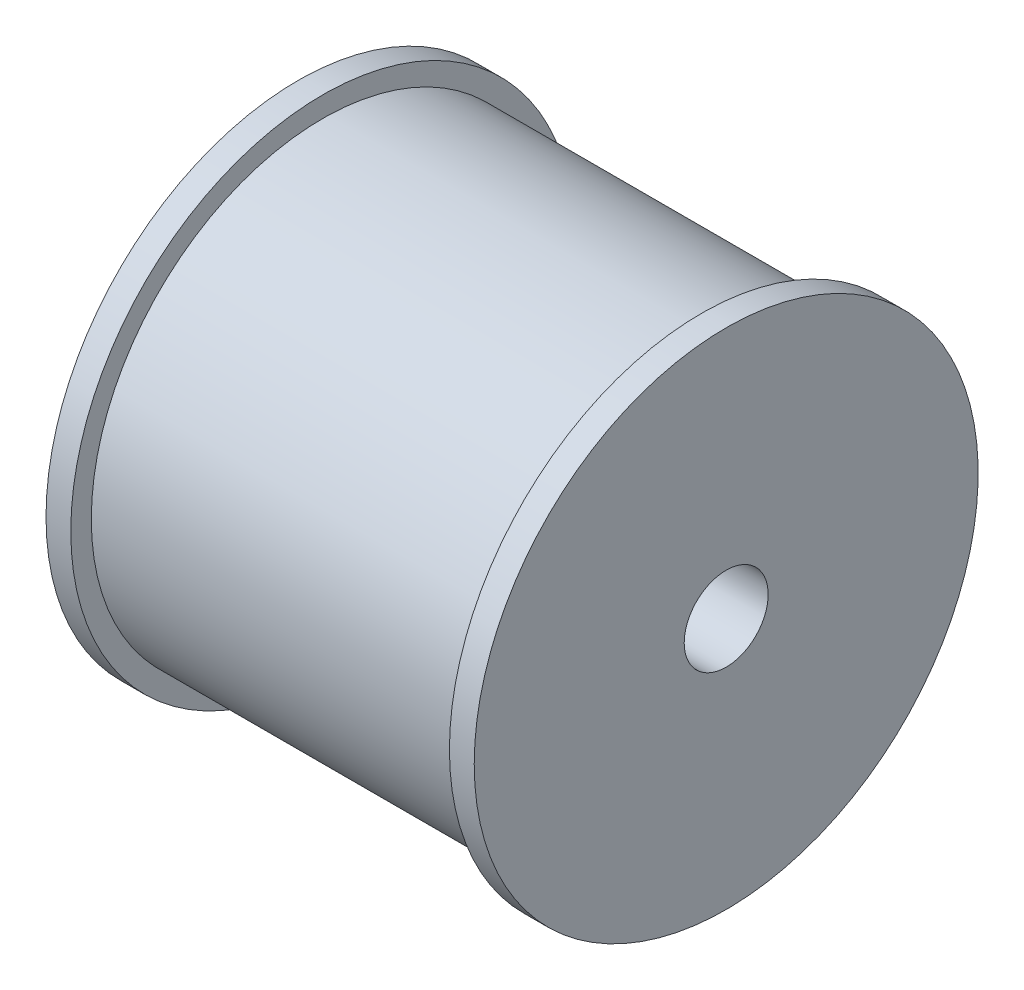
ISO-10303-21;
HEADER;
FILE_DESCRIPTION(('STEP AP214'),'2;1');
FILE_NAME('part.step','',(''),(''),'','','');
FILE_SCHEMA(('AUTOMOTIVE_DESIGN { 1 0 10303 214 1 1 1 1 }'));
ENDSEC;
DATA;
#1=APPLICATION_CONTEXT('core data for automotive mechanical design processes');
#2=APPLICATION_PROTOCOL_DEFINITION('international standard','automotive_design',2000,#1);
#3=PRODUCT_CONTEXT('',#1,'mechanical');
#4=PRODUCT('Part','Part','',(#3));
#5=PRODUCT_RELATED_PRODUCT_CATEGORY('part','',(#4));
#6=PRODUCT_DEFINITION_FORMATION('','',#4);
#7=PRODUCT_DEFINITION_CONTEXT('part definition',#1,'design');
#8=PRODUCT_DEFINITION('design','',#6,#7);
#9=PRODUCT_DEFINITION_SHAPE('','',#8);
#10=(LENGTH_UNIT() NAMED_UNIT(*) SI_UNIT(.MILLI.,.METRE.));
#11=(NAMED_UNIT(*) PLANE_ANGLE_UNIT() SI_UNIT($,.RADIAN.));
#12=(NAMED_UNIT(*) SI_UNIT($,.STERADIAN.) SOLID_ANGLE_UNIT());
#13=UNCERTAINTY_MEASURE_WITH_UNIT(LENGTH_MEASURE(1.E-05),#10,'distance_accuracy_value','');
#14=(GEOMETRIC_REPRESENTATION_CONTEXT(3) GLOBAL_UNCERTAINTY_ASSIGNED_CONTEXT((#13)) GLOBAL_UNIT_ASSIGNED_CONTEXT((#10,
#11,#12)) REPRESENTATION_CONTEXT('',''));
#15=CARTESIAN_POINT('',(0.,0.,0.));
#16=DIRECTION('',(0.,0.,1.));
#17=DIRECTION('',(1.,0.,0.));
#18=AXIS2_PLACEMENT_3D('',#15,#16,#17);
#19=CARTESIAN_POINT('',(15.,0.,0.));
#20=DIRECTION('',(1.,0.,0.));
#21=DIRECTION('',(0.,0.,-1.));
#22=AXIS2_PLACEMENT_3D('',#19,#20,#21);
#23=CYLINDRICAL_SURFACE('',#22,107.95);
#24=CARTESIAN_POINT('',(15.,0.,0.));
#25=DIRECTION('',(1.,0.,0.));
#26=DIRECTION('',(0.,0.,-1.));
#27=AXIS2_PLACEMENT_3D('',#24,#25,#26);
#28=CIRCLE('',#27,107.95);
#29=CARTESIAN_POINT('',(15.,0.,-107.95));
#30=VERTEX_POINT('',#29);
#31=EDGE_CURVE('E47',#30,#30,#28,.T.);
#32=ORIENTED_EDGE('',*,*,#31,.T.);
#33=EDGE_LOOP('',(#32));
#34=FACE_BOUND('',#33,.T.);
#35=CARTESIAN_POINT('',(244.,0.,0.));
#36=DIRECTION('',(1.,0.,0.));
#37=DIRECTION('',(0.,0.,-1.));
#38=AXIS2_PLACEMENT_3D('',#35,#36,#37);
#39=CIRCLE('',#38,107.95);
#40=CARTESIAN_POINT('',(244.,0.,-107.95));
#41=VERTEX_POINT('',#40);
#42=EDGE_CURVE('E11',#41,#41,#39,.F.);
#43=ORIENTED_EDGE('',*,*,#42,.T.);
#44=EDGE_LOOP('',(#43));
#45=FACE_BOUND('',#44,.T.);
#46=ADVANCED_FACE('F43',(#34,#45),#23,.T.);
#47=OPEN_SHELL('',(#46));
#48=SHELL_BASED_SURFACE_MODEL('B2',(#47));
#49=CARTESIAN_POINT('',(15.,0.,0.));
#50=DIRECTION('',(1.,0.,0.));
#51=DIRECTION('',(0.,0.,-1.));
#52=AXIS2_PLACEMENT_3D('',#49,#50,#51);
#53=CYLINDRICAL_SURFACE('',#52,63.5);
#54=CARTESIAN_POINT('',(15.,0.,0.));
#55=DIRECTION('',(1.,0.,0.));
#56=DIRECTION('',(0.,0.,-1.));
#57=AXIS2_PLACEMENT_3D('',#54,#55,#56);
#58=CIRCLE('',#57,63.5);
#59=CARTESIAN_POINT('',(15.,0.,-63.5));
#60=VERTEX_POINT('',#59);
#61=EDGE_CURVE('E78',#60,#60,#58,.T.);
#62=ORIENTED_EDGE('',*,*,#61,.T.);
#63=EDGE_LOOP('',(#62));
#64=FACE_BOUND('',#63,.T.);
#65=CARTESIAN_POINT('',(244.,0.,0.));
#66=DIRECTION('',(1.,0.,0.));
#67=DIRECTION('',(0.,0.,-1.));
#68=AXIS2_PLACEMENT_3D('',#65,#66,#67);
#69=CIRCLE('',#68,63.5);
#70=CARTESIAN_POINT('',(244.,0.,-63.5));
#71=VERTEX_POINT('',#70);
#72=EDGE_CURVE('E42',#71,#71,#69,.F.);
#73=ORIENTED_EDGE('',*,*,#72,.T.);
#74=EDGE_LOOP('',(#73));
#75=FACE_BOUND('',#74,.T.);
#76=ADVANCED_FACE('F74',(#64,#75),#53,.T.);
#77=OPEN_SHELL('',(#76));
#78=SHELL_BASED_SURFACE_MODEL('B6',(#77));
#79=CARTESIAN_POINT('',(0.,0.,0.));
#80=DIRECTION('',(-1.,0.,0.));
#81=DIRECTION('',(0.,0.,1.));
#82=AXIS2_PLACEMENT_3D('',#79,#80,#81);
#83=CYLINDRICAL_SURFACE('',#82,25.4);
#84=CARTESIAN_POINT('',(259.,0.,0.));
#85=DIRECTION('',(-1.,0.,0.));
#86=DIRECTION('',(0.,0.,1.));
#87=AXIS2_PLACEMENT_3D('',#84,#85,#86);
#88=CIRCLE('',#87,25.4);
#89=CARTESIAN_POINT('',(259.,0.,25.4));
#90=VERTEX_POINT('',#89);
#91=EDGE_CURVE('E126',#90,#90,#88,.T.);
#92=ORIENTED_EDGE('',*,*,#91,.F.);
#93=EDGE_LOOP('',(#92));
#94=FACE_BOUND('',#93,.T.);
#95=CARTESIAN_POINT('',(0.,0.,0.));
#96=DIRECTION('',(-1.,0.,0.));
#97=DIRECTION('',(0.,0.,1.));
#98=AXIS2_PLACEMENT_3D('',#95,#96,#97);
#99=CIRCLE('',#98,25.4);
#100=CARTESIAN_POINT('',(0.,0.,25.4));
#101=VERTEX_POINT('',#100);
#102=EDGE_CURVE('E73',#101,#101,#99,.T.);
#103=ORIENTED_EDGE('',*,*,#102,.T.);
#104=EDGE_LOOP('',(#103));
#105=FACE_BOUND('',#104,.T.);
#106=ADVANCED_FACE('F98',(#94,#105),#83,.F.);
#107=CARTESIAN_POINT('',(0.,25.4,0.));
#108=DIRECTION('',(1.,0.,0.));
#109=DIRECTION('',(0.,0.,-1.));
#110=AXIS2_PLACEMENT_3D('',#107,#108,#109);
#111=PLANE('',#110);
#112=ORIENTED_EDGE('',*,*,#102,.F.);
#113=EDGE_LOOP('',(#112));
#114=FACE_BOUND('',#113,.T.);
#115=CARTESIAN_POINT('',(0.,0.,0.));
#116=DIRECTION('',(-1.,0.,0.));
#117=DIRECTION('',(0.,0.,1.));
#118=AXIS2_PLACEMENT_3D('',#115,#116,#117);
#119=CIRCLE('',#118,152.4);
#120=CARTESIAN_POINT('',(0.,0.,152.4));
#121=VERTEX_POINT('',#120);
#122=EDGE_CURVE('E104',#121,#121,#119,.T.);
#123=ORIENTED_EDGE('',*,*,#122,.T.);
#124=EDGE_LOOP('',(#123));
#125=FACE_BOUND('',#124,.T.);
#126=ADVANCED_FACE('F133',(#114,#125),#111,.F.);
#127=CARTESIAN_POINT('',(0.,0.,0.));
#128=DIRECTION('',(-1.,0.,0.));
#129=DIRECTION('',(0.,0.,1.));
#130=AXIS2_PLACEMENT_3D('',#127,#128,#129);
#131=CYLINDRICAL_SURFACE('',#130,152.4);
#132=ORIENTED_EDGE('',*,*,#122,.F.);
#133=EDGE_LOOP('',(#132));
#134=FACE_BOUND('',#133,.T.);
#135=CARTESIAN_POINT('',(15.,0.,0.));
#136=DIRECTION('',(-1.,0.,0.));
#137=DIRECTION('',(0.,0.,1.));
#138=AXIS2_PLACEMENT_3D('',#135,#136,#137);
#139=CIRCLE('',#138,152.4);
#140=CARTESIAN_POINT('',(15.,0.,152.4));
#141=VERTEX_POINT('',#140);
#142=EDGE_CURVE('E108',#141,#141,#139,.T.);
#143=ORIENTED_EDGE('',*,*,#142,.T.);
#144=EDGE_LOOP('',(#143));
#145=FACE_BOUND('',#144,.T.);
#146=ADVANCED_FACE('F137',(#134,#145),#131,.T.);
#147=CARTESIAN_POINT('',(15.,152.4,0.));
#148=DIRECTION('',(-1.,0.,0.));
#149=DIRECTION('',(0.,0.,1.));
#150=AXIS2_PLACEMENT_3D('',#147,#148,#149);
#151=PLANE('',#150);
#152=ORIENTED_EDGE('',*,*,#142,.F.);
#153=EDGE_LOOP('',(#152));
#154=FACE_BOUND('',#153,.T.);
#155=CARTESIAN_POINT('',(15.,0.,0.));
#156=DIRECTION('',(-1.,0.,0.));
#157=DIRECTION('',(0.,0.,1.));
#158=AXIS2_PLACEMENT_3D('',#155,#156,#157);
#159=CIRCLE('',#158,140.);
#160=CARTESIAN_POINT('',(15.,0.,140.));
#161=VERTEX_POINT('',#160);
#162=EDGE_CURVE('E112',#161,#161,#159,.T.);
#163=ORIENTED_EDGE('',*,*,#162,.T.);
#164=EDGE_LOOP('',(#163));
#165=FACE_BOUND('',#164,.T.);
#166=ADVANCED_FACE('F142',(#154,#165),#151,.F.);
#167=CARTESIAN_POINT('',(0.,0.,0.));
#168=DIRECTION('',(-1.,0.,0.));
#169=DIRECTION('',(0.,0.,1.));
#170=AXIS2_PLACEMENT_3D('',#167,#168,#169);
#171=CYLINDRICAL_SURFACE('',#170,140.);
#172=ORIENTED_EDGE('',*,*,#162,.F.);
#173=EDGE_LOOP('',(#172));
#174=FACE_BOUND('',#173,.T.);
#175=CARTESIAN_POINT('',(244.,0.,0.));
#176=DIRECTION('',(-1.,0.,0.));
#177=DIRECTION('',(0.,0.,1.));
#178=AXIS2_PLACEMENT_3D('',#175,#176,#177);
#179=CIRCLE('',#178,140.);
#180=CARTESIAN_POINT('',(244.,0.,140.));
#181=VERTEX_POINT('',#180);
#182=EDGE_CURVE('E117',#181,#181,#179,.T.);
#183=ORIENTED_EDGE('',*,*,#182,.T.);
#184=EDGE_LOOP('',(#183));
#185=FACE_BOUND('',#184,.T.);
#186=ADVANCED_FACE('F148',(#174,#185),#171,.T.);
#187=CARTESIAN_POINT('',(244.,140.,0.));
#188=DIRECTION('',(1.,0.,0.));
#189=DIRECTION('',(0.,0.,-1.));
#190=AXIS2_PLACEMENT_3D('',#187,#188,#189);
#191=PLANE('',#190);
#192=ORIENTED_EDGE('',*,*,#182,.F.);
#193=EDGE_LOOP('',(#192));
#194=FACE_BOUND('',#193,.T.);
#195=CARTESIAN_POINT('',(244.,0.,0.));
#196=DIRECTION('',(-1.,0.,0.));
#197=DIRECTION('',(0.,0.,1.));
#198=AXIS2_PLACEMENT_3D('',#195,#196,#197);
#199=CIRCLE('',#198,152.4);
#200=CARTESIAN_POINT('',(244.,0.,152.4));
#201=VERTEX_POINT('',#200);
#202=EDGE_CURVE('E120',#201,#201,#199,.T.);
#203=ORIENTED_EDGE('',*,*,#202,.T.);
#204=EDGE_LOOP('',(#203));
#205=FACE_BOUND('',#204,.T.);
#206=ADVANCED_FACE('F152',(#194,#205),#191,.F.);
#207=CARTESIAN_POINT('',(0.,0.,0.));
#208=DIRECTION('',(-1.,0.,0.));
#209=DIRECTION('',(0.,0.,1.));
#210=AXIS2_PLACEMENT_3D('',#207,#208,#209);
#211=CYLINDRICAL_SURFACE('',#210,152.4);
#212=ORIENTED_EDGE('',*,*,#202,.F.);
#213=EDGE_LOOP('',(#212));
#214=FACE_BOUND('',#213,.T.);
#215=CARTESIAN_POINT('',(259.,0.,0.));
#216=DIRECTION('',(-1.,0.,0.));
#217=DIRECTION('',(0.,0.,1.));
#218=AXIS2_PLACEMENT_3D('',#215,#216,#217);
#219=CIRCLE('',#218,152.4);
#220=CARTESIAN_POINT('',(259.,0.,152.4));
#221=VERTEX_POINT('',#220);
#222=EDGE_CURVE('E123',#221,#221,#219,.T.);
#223=ORIENTED_EDGE('',*,*,#222,.T.);
#224=EDGE_LOOP('',(#223));
#225=FACE_BOUND('',#224,.T.);
#226=ADVANCED_FACE('F156',(#214,#225),#211,.T.);
#227=CARTESIAN_POINT('',(259.,152.4,0.));
#228=DIRECTION('',(-1.,0.,0.));
#229=DIRECTION('',(0.,0.,1.));
#230=AXIS2_PLACEMENT_3D('',#227,#228,#229);
#231=PLANE('',#230);
#232=ORIENTED_EDGE('',*,*,#222,.F.);
#233=EDGE_LOOP('',(#232));
#234=FACE_BOUND('',#233,.T.);
#235=ORIENTED_EDGE('',*,*,#91,.T.);
#236=EDGE_LOOP('',(#235));
#237=FACE_BOUND('',#236,.T.);
#238=ADVANCED_FACE('F130',(#234,#237),#231,.F.);
#239=CLOSED_SHELL('',(#106,#126,#146,#166,#186,#206,#226,#238));
#240=MANIFOLD_SOLID_BREP('B37',#239);
#241=ADVANCED_BREP_SHAPE_REPRESENTATION('',(#18,#240),#14);
#242=MANIFOLD_SURFACE_SHAPE_REPRESENTATION('',(#18,#48,#78),#14);
#243=SHAPE_REPRESENTATION('',(#18),#14);
#244=SHAPE_DEFINITION_REPRESENTATION(#9,#243);
#245=SHAPE_REPRESENTATION_RELATIONSHIP('','',#243,#241);
#246=SHAPE_REPRESENTATION_RELATIONSHIP('','',#243,#242);
ENDSEC;
END-ISO-10303-21;
